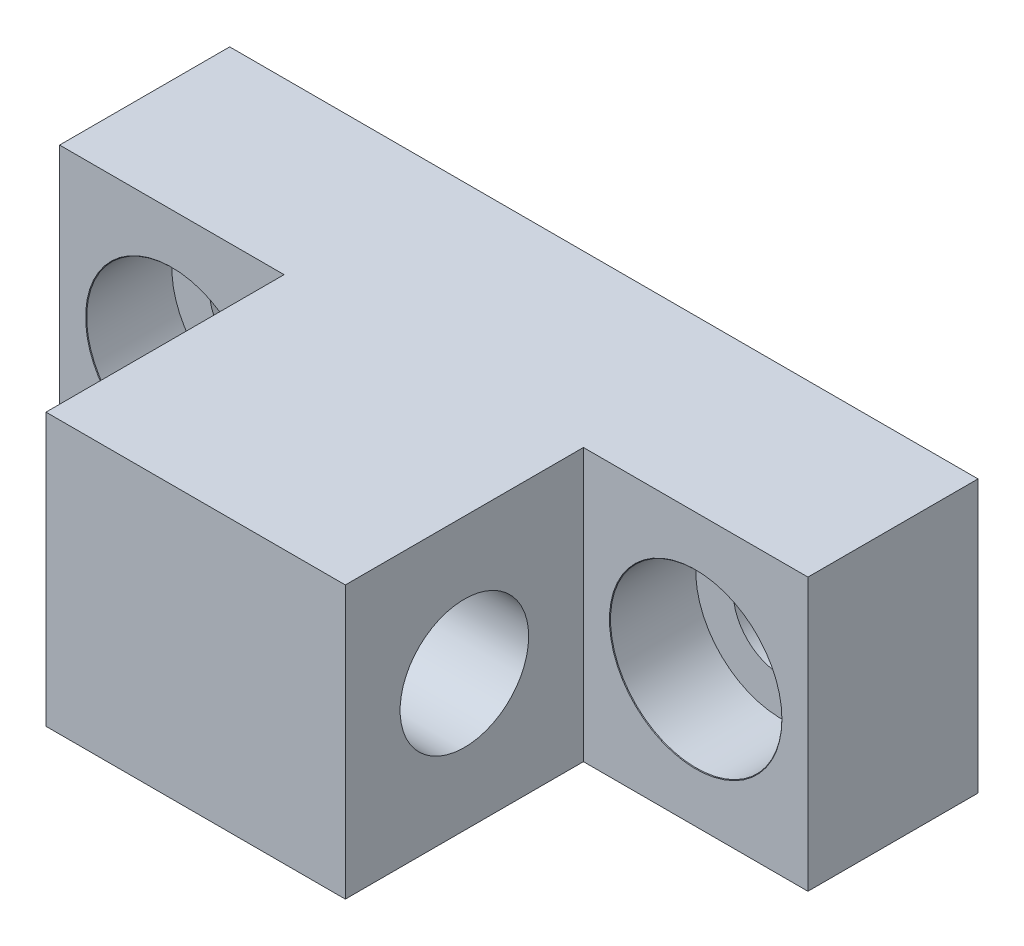
ISO-10303-21;
HEADER;
FILE_DESCRIPTION(('STEP AP214'),'2;1');
FILE_NAME('part.step','',(''),(''),'','','');
FILE_SCHEMA(('AUTOMOTIVE_DESIGN { 1 0 10303 214 1 1 1 1 }'));
ENDSEC;
DATA;
#1=APPLICATION_CONTEXT('core data for automotive mechanical design processes');
#2=APPLICATION_PROTOCOL_DEFINITION('international standard','automotive_design',2000,#1);
#3=PRODUCT_CONTEXT('',#1,'mechanical');
#4=PRODUCT('Part','Part','',(#3));
#5=PRODUCT_RELATED_PRODUCT_CATEGORY('part','',(#4));
#6=PRODUCT_DEFINITION_FORMATION('','',#4);
#7=PRODUCT_DEFINITION_CONTEXT('part definition',#1,'design');
#8=PRODUCT_DEFINITION('design','',#6,#7);
#9=PRODUCT_DEFINITION_SHAPE('','',#8);
#10=(LENGTH_UNIT() NAMED_UNIT(*) SI_UNIT(.MILLI.,.METRE.));
#11=(NAMED_UNIT(*) PLANE_ANGLE_UNIT() SI_UNIT($,.RADIAN.));
#12=(NAMED_UNIT(*) SI_UNIT($,.STERADIAN.) SOLID_ANGLE_UNIT());
#13=UNCERTAINTY_MEASURE_WITH_UNIT(LENGTH_MEASURE(1.E-05),#10,'distance_accuracy_value','');
#14=(GEOMETRIC_REPRESENTATION_CONTEXT(3) GLOBAL_UNCERTAINTY_ASSIGNED_CONTEXT((#13)) GLOBAL_UNIT_ASSIGNED_CONTEXT((#10,
#11,#12)) REPRESENTATION_CONTEXT('',''));
#15=CARTESIAN_POINT('',(0.,0.,0.));
#16=DIRECTION('',(0.,0.,1.));
#17=DIRECTION('',(1.,0.,0.));
#18=AXIS2_PLACEMENT_3D('',#15,#16,#17);
#19=CARTESIAN_POINT('',(0.,0.,7.9375));
#20=DIRECTION('',(0.,0.,1.));
#21=DIRECTION('',(1.,0.,0.));
#22=AXIS2_PLACEMENT_3D('',#19,#20,#21);
#23=PLANE('',#22);
#24=CARTESIAN_POINT('',(12.22375,0.,7.9375));
#25=DIRECTION('',(0.,0.,1.));
#26=DIRECTION('',(1.,0.,0.));
#27=AXIS2_PLACEMENT_3D('',#24,#25,#26);
#28=CIRCLE('',#27,4.025);
#29=CARTESIAN_POINT('',(16.24875,0.,7.9375));
#30=VERTEX_POINT('',#29);
#31=EDGE_CURVE('E216',#30,#30,#28,.T.);
#32=ORIENTED_EDGE('',*,*,#31,.F.);
#33=EDGE_LOOP('',(#32));
#34=FACE_BOUND('',#33,.T.);
#35=DIRECTION('',(0.,1.,0.));
#36=VECTOR('',#35,1.);
#37=CARTESIAN_POINT('',(6.985,0.,7.9375));
#38=LINE('',#37,#36);
#39=CARTESIAN_POINT('',(6.985,-6.35,7.9375));
#40=VERTEX_POINT('',#39);
#41=CARTESIAN_POINT('',(6.985,6.35,7.9375));
#42=VERTEX_POINT('',#41);
#43=EDGE_CURVE('E58',#40,#42,#38,.T.);
#44=ORIENTED_EDGE('',*,*,#43,.F.);
#45=DIRECTION('',(1.,0.,0.));
#46=VECTOR('',#45,1.);
#47=CARTESIAN_POINT('',(0.,-6.35,7.9375));
#48=LINE('',#47,#46);
#49=CARTESIAN_POINT('',(17.4625,-6.35,7.9375));
#50=VERTEX_POINT('',#49);
#51=EDGE_CURVE('E142',#40,#50,#48,.T.);
#52=ORIENTED_EDGE('',*,*,#51,.T.);
#53=DIRECTION('',(0.,-1.,0.));
#54=VECTOR('',#53,1.);
#55=CARTESIAN_POINT('',(17.4625,0.,7.9375));
#56=LINE('',#55,#54);
#57=CARTESIAN_POINT('',(17.4625,6.35,7.9375));
#58=VERTEX_POINT('',#57);
#59=EDGE_CURVE('E145',#58,#50,#56,.T.);
#60=ORIENTED_EDGE('',*,*,#59,.F.);
#61=DIRECTION('',(1.,0.,0.));
#62=VECTOR('',#61,1.);
#63=CARTESIAN_POINT('',(0.,6.35,7.9375));
#64=LINE('',#63,#62);
#65=EDGE_CURVE('E63',#42,#58,#64,.T.);
#66=ORIENTED_EDGE('',*,*,#65,.F.);
#67=EDGE_LOOP('',(#44,#52,#60,#66));
#68=FACE_BOUND('',#67,.T.);
#69=ADVANCED_FACE('F43',(#34,#68),#23,.T.);
#70=CARTESIAN_POINT('',(0.,6.35,7.9375));
#71=DIRECTION('',(0.,1.,0.));
#72=DIRECTION('',(0.,0.,1.));
#73=AXIS2_PLACEMENT_3D('',#70,#71,#72);
#74=PLANE('',#73);
#75=DIRECTION('',(1.,0.,0.));
#76=VECTOR('',#75,1.);
#77=CARTESIAN_POINT('',(0.,6.35,0.));
#78=LINE('',#77,#76);
#79=CARTESIAN_POINT('',(-17.4625,6.35,0.));
#80=VERTEX_POINT('',#79);
#81=CARTESIAN_POINT('',(17.4625,6.35,0.));
#82=VERTEX_POINT('',#81);
#83=EDGE_CURVE('E130',#80,#82,#78,.T.);
#84=ORIENTED_EDGE('',*,*,#83,.F.);
#85=DIRECTION('',(0.,0.,-1.));
#86=VECTOR('',#85,1.);
#87=CARTESIAN_POINT('',(-17.4625,6.35,7.9375));
#88=LINE('',#87,#86);
#89=CARTESIAN_POINT('',(-17.4625,6.35,7.9375));
#90=VERTEX_POINT('',#89);
#91=EDGE_CURVE('E11',#90,#80,#88,.T.);
#92=ORIENTED_EDGE('',*,*,#91,.F.);
#93=CARTESIAN_POINT('',(-6.985,6.35,7.9375));
#94=VERTEX_POINT('',#93);
#95=EDGE_CURVE('E129',#90,#94,#64,.T.);
#96=ORIENTED_EDGE('',*,*,#95,.T.);
#97=DIRECTION('',(0.,0.,-1.));
#98=VECTOR('',#97,1.);
#99=CARTESIAN_POINT('',(-6.985,6.35,19.05));
#100=LINE('',#99,#98);
#101=CARTESIAN_POINT('',(-6.985,6.35,19.05));
#102=VERTEX_POINT('',#101);
#103=EDGE_CURVE('E110',#102,#94,#100,.T.);
#104=ORIENTED_EDGE('',*,*,#103,.F.);
#105=DIRECTION('',(-1.,0.,0.));
#106=VECTOR('',#105,1.);
#107=CARTESIAN_POINT('',(0.,6.35,19.05));
#108=LINE('',#107,#106);
#109=CARTESIAN_POINT('',(6.985,6.35,19.05));
#110=VERTEX_POINT('',#109);
#111=EDGE_CURVE('E116',#110,#102,#108,.T.);
#112=ORIENTED_EDGE('',*,*,#111,.F.);
#113=DIRECTION('',(0.,0.,-1.));
#114=VECTOR('',#113,1.);
#115=CARTESIAN_POINT('',(6.985,6.35,19.05));
#116=LINE('',#115,#114);
#117=EDGE_CURVE('E178',#110,#42,#116,.T.);
#118=ORIENTED_EDGE('',*,*,#117,.T.);
#119=ORIENTED_EDGE('',*,*,#65,.T.);
#120=DIRECTION('',(0.,0.,-1.));
#121=VECTOR('',#120,1.);
#122=CARTESIAN_POINT('',(17.4625,6.35,7.9375));
#123=LINE('',#122,#121);
#124=EDGE_CURVE('E147',#58,#82,#123,.T.);
#125=ORIENTED_EDGE('',*,*,#124,.T.);
#126=EDGE_LOOP('',(#84,#92,#96,#104,#112,#118,#119,#125));
#127=FACE_BOUND('',#126,.T.);
#128=ADVANCED_FACE('F45',(#127),#74,.T.);
#129=CARTESIAN_POINT('',(-17.4625,0.,7.9375));
#130=DIRECTION('',(1.,0.,0.));
#131=DIRECTION('',(0.,0.,-1.));
#132=AXIS2_PLACEMENT_3D('',#129,#130,#131);
#133=PLANE('',#132);
#134=DIRECTION('',(0.,-1.,0.));
#135=VECTOR('',#134,1.);
#136=CARTESIAN_POINT('',(-17.4625,0.,0.));
#137=LINE('',#136,#135);
#138=CARTESIAN_POINT('',(-17.4625,-6.35,0.));
#139=VERTEX_POINT('',#138);
#140=EDGE_CURVE('E133',#80,#139,#137,.T.);
#141=ORIENTED_EDGE('',*,*,#140,.T.);
#142=DIRECTION('',(0.,0.,-1.));
#143=VECTOR('',#142,1.);
#144=CARTESIAN_POINT('',(-17.4625,-6.35,7.9375));
#145=LINE('',#144,#143);
#146=CARTESIAN_POINT('',(-17.4625,-6.35,7.9375));
#147=VERTEX_POINT('',#146);
#148=EDGE_CURVE('E51',#147,#139,#145,.T.);
#149=ORIENTED_EDGE('',*,*,#148,.F.);
#150=DIRECTION('',(0.,-1.,0.));
#151=VECTOR('',#150,1.);
#152=CARTESIAN_POINT('',(-17.4625,0.,7.9375));
#153=LINE('',#152,#151);
#154=EDGE_CURVE('E140',#90,#147,#153,.T.);
#155=ORIENTED_EDGE('',*,*,#154,.F.);
#156=ORIENTED_EDGE('',*,*,#91,.T.);
#157=EDGE_LOOP('',(#141,#149,#155,#156));
#158=FACE_BOUND('',#157,.T.);
#159=ADVANCED_FACE('F244',(#158),#133,.F.);
#160=CARTESIAN_POINT('',(0.,-6.35,7.9375));
#161=DIRECTION('',(0.,1.,0.));
#162=DIRECTION('',(0.,0.,1.));
#163=AXIS2_PLACEMENT_3D('',#160,#161,#162);
#164=PLANE('',#163);
#165=DIRECTION('',(1.,0.,0.));
#166=VECTOR('',#165,1.);
#167=CARTESIAN_POINT('',(0.,-6.35,0.));
#168=LINE('',#167,#166);
#169=CARTESIAN_POINT('',(17.4625,-6.35,0.));
#170=VERTEX_POINT('',#169);
#171=EDGE_CURVE('E150',#139,#170,#168,.T.);
#172=ORIENTED_EDGE('',*,*,#171,.T.);
#173=DIRECTION('',(0.,0.,-1.));
#174=VECTOR('',#173,1.);
#175=CARTESIAN_POINT('',(17.4625,-6.35,7.9375));
#176=LINE('',#175,#174);
#177=EDGE_CURVE('E157',#50,#170,#176,.T.);
#178=ORIENTED_EDGE('',*,*,#177,.F.);
#179=ORIENTED_EDGE('',*,*,#51,.F.);
#180=DIRECTION('',(0.,0.,-1.));
#181=VECTOR('',#180,1.);
#182=CARTESIAN_POINT('',(6.985,-6.35,19.05));
#183=LINE('',#182,#181);
#184=CARTESIAN_POINT('',(6.985,-6.35,19.05));
#185=VERTEX_POINT('',#184);
#186=EDGE_CURVE('E135',#185,#40,#183,.T.);
#187=ORIENTED_EDGE('',*,*,#186,.F.);
#188=DIRECTION('',(1.,0.,0.));
#189=VECTOR('',#188,1.);
#190=CARTESIAN_POINT('',(0.,-6.35,19.05));
#191=LINE('',#190,#189);
#192=CARTESIAN_POINT('',(-6.985,-6.35,19.05));
#193=VERTEX_POINT('',#192);
#194=EDGE_CURVE('E115',#193,#185,#191,.T.);
#195=ORIENTED_EDGE('',*,*,#194,.F.);
#196=DIRECTION('',(0.,0.,-1.));
#197=VECTOR('',#196,1.);
#198=CARTESIAN_POINT('',(-6.985,-6.35,19.05));
#199=LINE('',#198,#197);
#200=CARTESIAN_POINT('',(-6.985,-6.35,7.9375));
#201=VERTEX_POINT('',#200);
#202=EDGE_CURVE('E112',#193,#201,#199,.T.);
#203=ORIENTED_EDGE('',*,*,#202,.T.);
#204=EDGE_CURVE('E143',#147,#201,#48,.T.);
#205=ORIENTED_EDGE('',*,*,#204,.F.);
#206=ORIENTED_EDGE('',*,*,#148,.T.);
#207=EDGE_LOOP('',(#172,#178,#179,#187,#195,#203,#205,#206));
#208=FACE_BOUND('',#207,.T.);
#209=ADVANCED_FACE('F163',(#208),#164,.F.);
#210=CARTESIAN_POINT('',(17.4625,0.,7.9375));
#211=DIRECTION('',(1.,0.,0.));
#212=DIRECTION('',(0.,0.,-1.));
#213=AXIS2_PLACEMENT_3D('',#210,#211,#212);
#214=PLANE('',#213);
#215=DIRECTION('',(0.,-1.,0.));
#216=VECTOR('',#215,1.);
#217=CARTESIAN_POINT('',(17.4625,0.,0.));
#218=LINE('',#217,#216);
#219=EDGE_CURVE('E153',#82,#170,#218,.T.);
#220=ORIENTED_EDGE('',*,*,#219,.F.);
#221=ORIENTED_EDGE('',*,*,#124,.F.);
#222=ORIENTED_EDGE('',*,*,#59,.T.);
#223=ORIENTED_EDGE('',*,*,#177,.T.);
#224=EDGE_LOOP('',(#220,#221,#222,#223));
#225=FACE_BOUND('',#224,.T.);
#226=ADVANCED_FACE('F173',(#225),#214,.T.);
#227=CARTESIAN_POINT('',(-12.22375,0.,7.9375));
#228=DIRECTION('',(0.,0.,1.));
#229=DIRECTION('',(1.,0.,0.));
#230=AXIS2_PLACEMENT_3D('',#227,#228,#229);
#231=CIRCLE('',#230,4.025);
#232=CARTESIAN_POINT('',(-8.19875,0.,7.9375));
#233=VERTEX_POINT('',#232);
#234=EDGE_CURVE('E201',#233,#233,#231,.T.);
#235=ORIENTED_EDGE('',*,*,#234,.F.);
#236=EDGE_LOOP('',(#235));
#237=FACE_BOUND('',#236,.T.);
#238=DIRECTION('',(0.,-1.,0.));
#239=VECTOR('',#238,1.);
#240=CARTESIAN_POINT('',(-6.985,0.,7.9375));
#241=LINE('',#240,#239);
#242=EDGE_CURVE('E182',#94,#201,#241,.T.);
#243=ORIENTED_EDGE('',*,*,#242,.F.);
#244=ORIENTED_EDGE('',*,*,#95,.F.);
#245=ORIENTED_EDGE('',*,*,#154,.T.);
#246=ORIENTED_EDGE('',*,*,#204,.T.);
#247=EDGE_LOOP('',(#243,#244,#245,#246));
#248=FACE_BOUND('',#247,.T.);
#249=ADVANCED_FACE('F235',(#237,#248),#23,.T.);
#250=CARTESIAN_POINT('',(0.,0.,0.));
#251=DIRECTION('',(0.,0.,1.));
#252=DIRECTION('',(1.,0.,0.));
#253=AXIS2_PLACEMENT_3D('',#250,#251,#252);
#254=PLANE('',#253);
#255=CARTESIAN_POINT('',(12.22375,0.,0.));
#256=DIRECTION('',(0.,0.,1.));
#257=DIRECTION('',(1.,0.,0.));
#258=AXIS2_PLACEMENT_3D('',#255,#256,#257);
#259=CIRCLE('',#258,2.25);
#260=CARTESIAN_POINT('',(14.47375,0.,0.));
#261=VERTEX_POINT('',#260);
#262=EDGE_CURVE('E204',#261,#261,#259,.T.);
#263=ORIENTED_EDGE('',*,*,#262,.T.);
#264=EDGE_LOOP('',(#263));
#265=FACE_BOUND('',#264,.T.);
#266=CARTESIAN_POINT('',(-12.22375,0.,0.));
#267=DIRECTION('',(0.,0.,1.));
#268=DIRECTION('',(1.,0.,0.));
#269=AXIS2_PLACEMENT_3D('',#266,#267,#268);
#270=CIRCLE('',#269,2.25);
#271=CARTESIAN_POINT('',(-9.97375,0.,0.));
#272=VERTEX_POINT('',#271);
#273=EDGE_CURVE('E189',#272,#272,#270,.T.);
#274=ORIENTED_EDGE('',*,*,#273,.T.);
#275=EDGE_LOOP('',(#274));
#276=FACE_BOUND('',#275,.T.);
#277=ORIENTED_EDGE('',*,*,#83,.T.);
#278=ORIENTED_EDGE('',*,*,#219,.T.);
#279=ORIENTED_EDGE('',*,*,#171,.F.);
#280=ORIENTED_EDGE('',*,*,#140,.F.);
#281=EDGE_LOOP('',(#277,#278,#279,#280));
#282=FACE_BOUND('',#281,.T.);
#283=ADVANCED_FACE('F169',(#265,#276,#282),#254,.F.);
#284=CARTESIAN_POINT('',(-6.985,0.,19.05));
#285=DIRECTION('',(1.,0.,0.));
#286=DIRECTION('',(0.,0.,-1.));
#287=AXIS2_PLACEMENT_3D('',#284,#285,#286);
#288=PLANE('',#287);
#289=CARTESIAN_POINT('',(-6.985,0.,13.49375));
#290=DIRECTION('',(1.,0.,0.));
#291=DIRECTION('',(0.,0.,-1.));
#292=AXIS2_PLACEMENT_3D('',#289,#290,#291);
#293=CIRCLE('',#292,3.);
#294=CARTESIAN_POINT('',(-6.985,0.,10.49375));
#295=VERTEX_POINT('',#294);
#296=EDGE_CURVE('E219',#295,#295,#293,.F.);
#297=ORIENTED_EDGE('',*,*,#296,.F.);
#298=EDGE_LOOP('',(#297));
#299=FACE_BOUND('',#298,.T.);
#300=ORIENTED_EDGE('',*,*,#242,.T.);
#301=ORIENTED_EDGE('',*,*,#202,.F.);
#302=DIRECTION('',(0.,-1.,0.));
#303=VECTOR('',#302,1.);
#304=CARTESIAN_POINT('',(-6.985,0.,19.05));
#305=LINE('',#304,#303);
#306=EDGE_CURVE('E105',#102,#193,#305,.T.);
#307=ORIENTED_EDGE('',*,*,#306,.F.);
#308=ORIENTED_EDGE('',*,*,#103,.T.);
#309=EDGE_LOOP('',(#300,#301,#307,#308));
#310=FACE_BOUND('',#309,.T.);
#311=ADVANCED_FACE('F108',(#299,#310),#288,.F.);
#312=CARTESIAN_POINT('',(6.985,0.,19.05));
#313=DIRECTION('',(-1.,0.,0.));
#314=DIRECTION('',(0.,0.,1.));
#315=AXIS2_PLACEMENT_3D('',#312,#313,#314);
#316=PLANE('',#315);
#317=CARTESIAN_POINT('',(6.985,0.,13.49375));
#318=DIRECTION('',(1.,0.,0.));
#319=DIRECTION('',(0.,0.,-1.));
#320=AXIS2_PLACEMENT_3D('',#317,#318,#319);
#321=CIRCLE('',#320,3.);
#322=CARTESIAN_POINT('',(6.985,0.,10.49375));
#323=VERTEX_POINT('',#322);
#324=EDGE_CURVE('E184',#323,#323,#321,.T.);
#325=ORIENTED_EDGE('',*,*,#324,.F.);
#326=EDGE_LOOP('',(#325));
#327=FACE_BOUND('',#326,.T.);
#328=ORIENTED_EDGE('',*,*,#43,.T.);
#329=ORIENTED_EDGE('',*,*,#117,.F.);
#330=DIRECTION('',(0.,1.,0.));
#331=VECTOR('',#330,1.);
#332=CARTESIAN_POINT('',(6.985,0.,19.05));
#333=LINE('',#332,#331);
#334=EDGE_CURVE('E121',#185,#110,#333,.T.);
#335=ORIENTED_EDGE('',*,*,#334,.F.);
#336=ORIENTED_EDGE('',*,*,#186,.T.);
#337=EDGE_LOOP('',(#328,#329,#335,#336));
#338=FACE_BOUND('',#337,.T.);
#339=ADVANCED_FACE('F177',(#327,#338),#316,.F.);
#340=CARTESIAN_POINT('',(0.,0.,19.05));
#341=DIRECTION('',(0.,0.,1.));
#342=DIRECTION('',(1.,0.,0.));
#343=AXIS2_PLACEMENT_3D('',#340,#341,#342);
#344=PLANE('',#343);
#345=ORIENTED_EDGE('',*,*,#111,.T.);
#346=ORIENTED_EDGE('',*,*,#306,.T.);
#347=ORIENTED_EDGE('',*,*,#194,.T.);
#348=ORIENTED_EDGE('',*,*,#334,.T.);
#349=EDGE_LOOP('',(#345,#346,#347,#348));
#350=FACE_BOUND('',#349,.T.);
#351=ADVANCED_FACE('F119',(#350),#344,.T.);
#352=CARTESIAN_POINT('',(-4.445,0.,13.49375));
#353=DIRECTION('',(1.,0.,0.));
#354=DIRECTION('',(0.,0.,-1.));
#355=AXIS2_PLACEMENT_3D('',#352,#353,#354);
#356=CYLINDRICAL_SURFACE('',#355,3.);
#357=ORIENTED_EDGE('',*,*,#324,.T.);
#358=EDGE_LOOP('',(#357));
#359=FACE_BOUND('',#358,.T.);
#360=ORIENTED_EDGE('',*,*,#296,.T.);
#361=EDGE_LOOP('',(#360));
#362=FACE_BOUND('',#361,.T.);
#363=ADVANCED_FACE('F223',(#359,#362),#356,.F.);
#364=CARTESIAN_POINT('',(-12.22375,0.,7.9375));
#365=DIRECTION('',(0.,0.,1.));
#366=DIRECTION('',(1.,0.,0.));
#367=AXIS2_PLACEMENT_3D('',#364,#365,#366);
#368=CYLINDRICAL_SURFACE('',#367,2.25);
#369=ORIENTED_EDGE('',*,*,#273,.F.);
#370=EDGE_LOOP('',(#369));
#371=FACE_BOUND('',#370,.T.);
#372=CARTESIAN_POINT('',(-12.22375,0.,3.9375));
#373=DIRECTION('',(0.,0.,1.));
#374=DIRECTION('',(1.,0.,0.));
#375=AXIS2_PLACEMENT_3D('',#372,#373,#374);
#376=CIRCLE('',#375,2.25);
#377=CARTESIAN_POINT('',(-9.97375,0.,3.9375));
#378=VERTEX_POINT('',#377);
#379=EDGE_CURVE('E192',#378,#378,#376,.T.);
#380=ORIENTED_EDGE('',*,*,#379,.T.);
#381=EDGE_LOOP('',(#380));
#382=FACE_BOUND('',#381,.T.);
#383=ADVANCED_FACE('F325',(#371,#382),#368,.F.);
#384=CARTESIAN_POINT('',(-8.22375,0.,3.9375));
#385=DIRECTION('',(0.,0.,-1.));
#386=DIRECTION('',(-1.,0.,0.));
#387=AXIS2_PLACEMENT_3D('',#384,#385,#386);
#388=PLANE('',#387);
#389=ORIENTED_EDGE('',*,*,#379,.F.);
#390=EDGE_LOOP('',(#389));
#391=FACE_BOUND('',#390,.T.);
#392=CARTESIAN_POINT('',(-12.22375,0.,3.9375));
#393=DIRECTION('',(0.,0.,1.));
#394=DIRECTION('',(1.,0.,0.));
#395=AXIS2_PLACEMENT_3D('',#392,#393,#394);
#396=CIRCLE('',#395,4.);
#397=CARTESIAN_POINT('',(-8.22375,0.,3.9375));
#398=VERTEX_POINT('',#397);
#399=EDGE_CURVE('E195',#398,#398,#396,.T.);
#400=ORIENTED_EDGE('',*,*,#399,.T.);
#401=EDGE_LOOP('',(#400));
#402=FACE_BOUND('',#401,.T.);
#403=ADVANCED_FACE('F339',(#391,#402),#388,.F.);
#404=CARTESIAN_POINT('',(-12.22375,0.,7.9375));
#405=DIRECTION('',(0.,0.,1.));
#406=DIRECTION('',(1.,0.,0.));
#407=AXIS2_PLACEMENT_3D('',#404,#405,#406);
#408=CYLINDRICAL_SURFACE('',#407,4.);
#409=ORIENTED_EDGE('',*,*,#399,.F.);
#410=EDGE_LOOP('',(#409));
#411=FACE_BOUND('',#410,.T.);
#412=CARTESIAN_POINT('',(-12.22375,0.,7.9125));
#413=DIRECTION('',(0.,0.,1.));
#414=DIRECTION('',(1.,0.,0.));
#415=AXIS2_PLACEMENT_3D('',#412,#413,#414);
#416=CIRCLE('',#415,4.);
#417=CARTESIAN_POINT('',(-8.22375,0.,7.9125));
#418=VERTEX_POINT('',#417);
#419=EDGE_CURVE('E198',#418,#418,#416,.T.);
#420=ORIENTED_EDGE('',*,*,#419,.T.);
#421=EDGE_LOOP('',(#420));
#422=FACE_BOUND('',#421,.T.);
#423=ADVANCED_FACE('F351',(#411,#422),#408,.F.);
#424=CARTESIAN_POINT('',(-12.22375,0.,7.9375));
#425=DIRECTION('',(0.,0.,1.));
#426=DIRECTION('',(1.,0.,0.));
#427=AXIS2_PLACEMENT_3D('',#424,#425,#426);
#428=CONICAL_SURFACE('',#427,4.025,0.785398163397414);
#429=ORIENTED_EDGE('',*,*,#419,.F.);
#430=EDGE_LOOP('',(#429));
#431=FACE_BOUND('',#430,.T.);
#432=ORIENTED_EDGE('',*,*,#234,.T.);
#433=EDGE_LOOP('',(#432));
#434=FACE_BOUND('',#433,.T.);
#435=ADVANCED_FACE('F362',(#431,#434),#428,.F.);
#436=CARTESIAN_POINT('',(12.22375,0.,7.9375));
#437=DIRECTION('',(0.,0.,1.));
#438=DIRECTION('',(1.,0.,0.));
#439=AXIS2_PLACEMENT_3D('',#436,#437,#438);
#440=CYLINDRICAL_SURFACE('',#439,2.25);
#441=ORIENTED_EDGE('',*,*,#262,.F.);
#442=EDGE_LOOP('',(#441));
#443=FACE_BOUND('',#442,.T.);
#444=CARTESIAN_POINT('',(12.22375,0.,3.9375));
#445=DIRECTION('',(0.,0.,1.));
#446=DIRECTION('',(1.,0.,0.));
#447=AXIS2_PLACEMENT_3D('',#444,#445,#446);
#448=CIRCLE('',#447,2.25);
#449=CARTESIAN_POINT('',(14.47375,0.,3.9375));
#450=VERTEX_POINT('',#449);
#451=EDGE_CURVE('E207',#450,#450,#448,.T.);
#452=ORIENTED_EDGE('',*,*,#451,.T.);
#453=EDGE_LOOP('',(#452));
#454=FACE_BOUND('',#453,.T.);
#455=ADVANCED_FACE('F373',(#443,#454),#440,.F.);
#456=CARTESIAN_POINT('',(16.22375,0.,3.9375));
#457=DIRECTION('',(0.,0.,-1.));
#458=DIRECTION('',(-1.,0.,0.));
#459=AXIS2_PLACEMENT_3D('',#456,#457,#458);
#460=PLANE('',#459);
#461=ORIENTED_EDGE('',*,*,#451,.F.);
#462=EDGE_LOOP('',(#461));
#463=FACE_BOUND('',#462,.T.);
#464=CARTESIAN_POINT('',(12.22375,0.,3.9375));
#465=DIRECTION('',(0.,0.,1.));
#466=DIRECTION('',(1.,0.,0.));
#467=AXIS2_PLACEMENT_3D('',#464,#465,#466);
#468=CIRCLE('',#467,4.);
#469=CARTESIAN_POINT('',(16.22375,0.,3.9375));
#470=VERTEX_POINT('',#469);
#471=EDGE_CURVE('E210',#470,#470,#468,.T.);
#472=ORIENTED_EDGE('',*,*,#471,.T.);
#473=EDGE_LOOP('',(#472));
#474=FACE_BOUND('',#473,.T.);
#475=ADVANCED_FACE('F384',(#463,#474),#460,.F.);
#476=CARTESIAN_POINT('',(12.22375,0.,7.9375));
#477=DIRECTION('',(0.,0.,1.));
#478=DIRECTION('',(1.,0.,0.));
#479=AXIS2_PLACEMENT_3D('',#476,#477,#478);
#480=CYLINDRICAL_SURFACE('',#479,4.);
#481=ORIENTED_EDGE('',*,*,#471,.F.);
#482=EDGE_LOOP('',(#481));
#483=FACE_BOUND('',#482,.T.);
#484=CARTESIAN_POINT('',(12.22375,0.,7.9125));
#485=DIRECTION('',(0.,0.,1.));
#486=DIRECTION('',(1.,0.,0.));
#487=AXIS2_PLACEMENT_3D('',#484,#485,#486);
#488=CIRCLE('',#487,4.);
#489=CARTESIAN_POINT('',(16.22375,0.,7.9125));
#490=VERTEX_POINT('',#489);
#491=EDGE_CURVE('E213',#490,#490,#488,.T.);
#492=ORIENTED_EDGE('',*,*,#491,.T.);
#493=EDGE_LOOP('',(#492));
#494=FACE_BOUND('',#493,.T.);
#495=ADVANCED_FACE('F395',(#483,#494),#480,.F.);
#496=CARTESIAN_POINT('',(12.22375,0.,7.9375));
#497=DIRECTION('',(0.,0.,1.));
#498=DIRECTION('',(1.,0.,0.));
#499=AXIS2_PLACEMENT_3D('',#496,#497,#498);
#500=CONICAL_SURFACE('',#499,4.025,0.785398163397414);
#501=ORIENTED_EDGE('',*,*,#491,.F.);
#502=EDGE_LOOP('',(#501));
#503=FACE_BOUND('',#502,.T.);
#504=ORIENTED_EDGE('',*,*,#31,.T.);
#505=EDGE_LOOP('',(#504));
#506=FACE_BOUND('',#505,.T.);
#507=ADVANCED_FACE('F405',(#503,#506),#500,.F.);
#508=CLOSED_SHELL('',(#69,#128,#159,#209,#226,#249,#283,#311,#339,#351,#363,#383,#403,#423,#435,
#455,#475,#495,#507));
#509=MANIFOLD_SOLID_BREP('B2',#508);
#510=ADVANCED_BREP_SHAPE_REPRESENTATION('',(#18,#509),#14);
#511=SHAPE_DEFINITION_REPRESENTATION(#9,#510);
ENDSEC;
END-ISO-10303-21;
